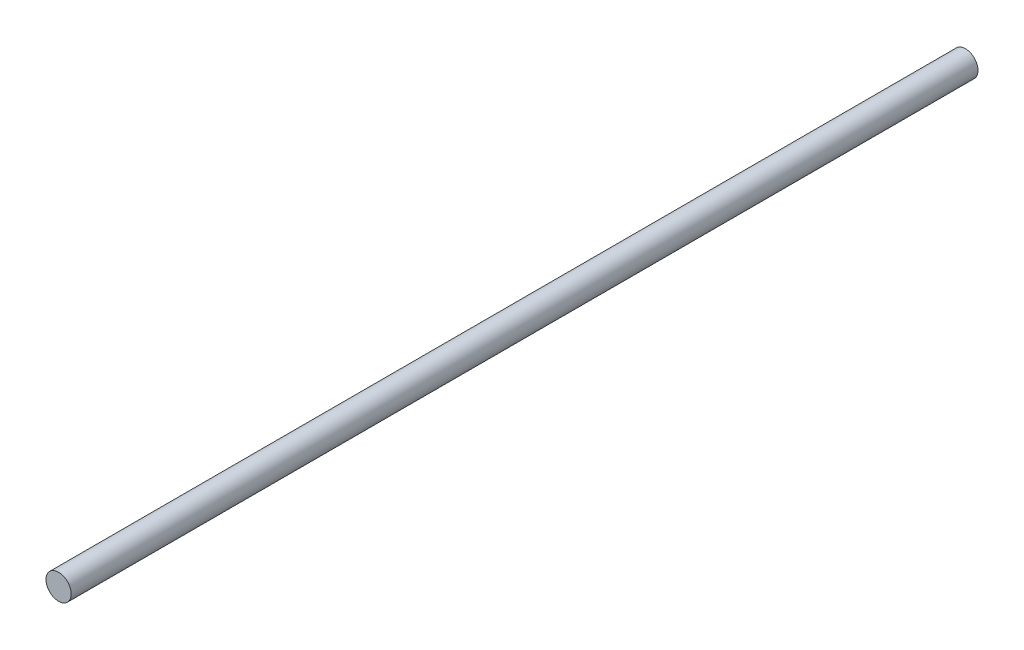
ISO-10303-21;
HEADER;
FILE_DESCRIPTION(('STEP AP214'),'2;1');
FILE_NAME('part.step','',(''),(''),'','','');
FILE_SCHEMA(('AUTOMOTIVE_DESIGN { 1 0 10303 214 1 1 1 1 }'));
ENDSEC;
DATA;
#1=APPLICATION_CONTEXT('core data for automotive mechanical design processes');
#2=APPLICATION_PROTOCOL_DEFINITION('international standard','automotive_design',2000,#1);
#3=PRODUCT_CONTEXT('',#1,'mechanical');
#4=PRODUCT('Part','Part','',(#3));
#5=PRODUCT_RELATED_PRODUCT_CATEGORY('part','',(#4));
#6=PRODUCT_DEFINITION_FORMATION('','',#4);
#7=PRODUCT_DEFINITION_CONTEXT('part definition',#1,'design');
#8=PRODUCT_DEFINITION('design','',#6,#7);
#9=PRODUCT_DEFINITION_SHAPE('','',#8);
#10=(LENGTH_UNIT() NAMED_UNIT(*) SI_UNIT(.MILLI.,.METRE.));
#11=(NAMED_UNIT(*) PLANE_ANGLE_UNIT() SI_UNIT($,.RADIAN.));
#12=(NAMED_UNIT(*) SI_UNIT($,.STERADIAN.) SOLID_ANGLE_UNIT());
#13=UNCERTAINTY_MEASURE_WITH_UNIT(LENGTH_MEASURE(1.E-05),#10,'distance_accuracy_value','');
#14=(GEOMETRIC_REPRESENTATION_CONTEXT(3) GLOBAL_UNCERTAINTY_ASSIGNED_CONTEXT((#13)) GLOBAL_UNIT_ASSIGNED_CONTEXT((#10,
#11,#12)) REPRESENTATION_CONTEXT('',''));
#15=CARTESIAN_POINT('',(0.,0.,0.));
#16=DIRECTION('',(0.,0.,1.));
#17=DIRECTION('',(1.,0.,0.));
#18=AXIS2_PLACEMENT_3D('',#15,#16,#17);
#19=CARTESIAN_POINT('',(0.,0.,457.2));
#20=DIRECTION('',(0.,0.,-1.));
#21=DIRECTION('',(-1.,0.,0.));
#22=AXIS2_PLACEMENT_3D('',#19,#20,#21);
#23=CYLINDRICAL_SURFACE('',#22,6.35);
#24=CARTESIAN_POINT('',(0.,0.,457.2));
#25=DIRECTION('',(0.,0.,1.));
#26=DIRECTION('',(1.,0.,0.));
#27=AXIS2_PLACEMENT_3D('',#24,#25,#26);
#28=CIRCLE('',#27,6.35);
#29=CARTESIAN_POINT('',(6.35,0.,457.2));
#30=VERTEX_POINT('',#29);
#31=EDGE_CURVE('E10',#30,#30,#28,.T.);
#32=ORIENTED_EDGE('',*,*,#31,.F.);
#33=EDGE_LOOP('',(#32));
#34=FACE_BOUND('',#33,.T.);
#35=CARTESIAN_POINT('',(0.,0.,0.));
#36=DIRECTION('',(0.,0.,1.));
#37=DIRECTION('',(1.,0.,0.));
#38=AXIS2_PLACEMENT_3D('',#35,#36,#37);
#39=CIRCLE('',#38,6.35);
#40=CARTESIAN_POINT('',(6.35,0.,0.));
#41=VERTEX_POINT('',#40);
#42=EDGE_CURVE('E35',#41,#41,#39,.T.);
#43=ORIENTED_EDGE('',*,*,#42,.T.);
#44=EDGE_LOOP('',(#43));
#45=FACE_BOUND('',#44,.T.);
#46=ADVANCED_FACE('F32',(#34,#45),#23,.T.);
#47=CARTESIAN_POINT('',(0.,0.,457.2));
#48=DIRECTION('',(0.,0.,1.));
#49=DIRECTION('',(1.,0.,0.));
#50=AXIS2_PLACEMENT_3D('',#47,#48,#49);
#51=PLANE('',#50);
#52=ORIENTED_EDGE('',*,*,#31,.T.);
#53=EDGE_LOOP('',(#52));
#54=FACE_BOUND('',#53,.T.);
#55=ADVANCED_FACE('F47',(#54),#51,.T.);
#56=CARTESIAN_POINT('',(0.,0.,0.));
#57=DIRECTION('',(0.,0.,1.));
#58=DIRECTION('',(1.,0.,0.));
#59=AXIS2_PLACEMENT_3D('',#56,#57,#58);
#60=PLANE('',#59);
#61=ORIENTED_EDGE('',*,*,#42,.F.);
#62=EDGE_LOOP('',(#61));
#63=FACE_BOUND('',#62,.T.);
#64=ADVANCED_FACE('F45',(#63),#60,.F.);
#65=CLOSED_SHELL('',(#46,#55,#64));
#66=MANIFOLD_SOLID_BREP('B2',#65);
#67=ADVANCED_BREP_SHAPE_REPRESENTATION('',(#18,#66),#14);
#68=SHAPE_DEFINITION_REPRESENTATION(#9,#67);
ENDSEC;
END-ISO-10303-21;
